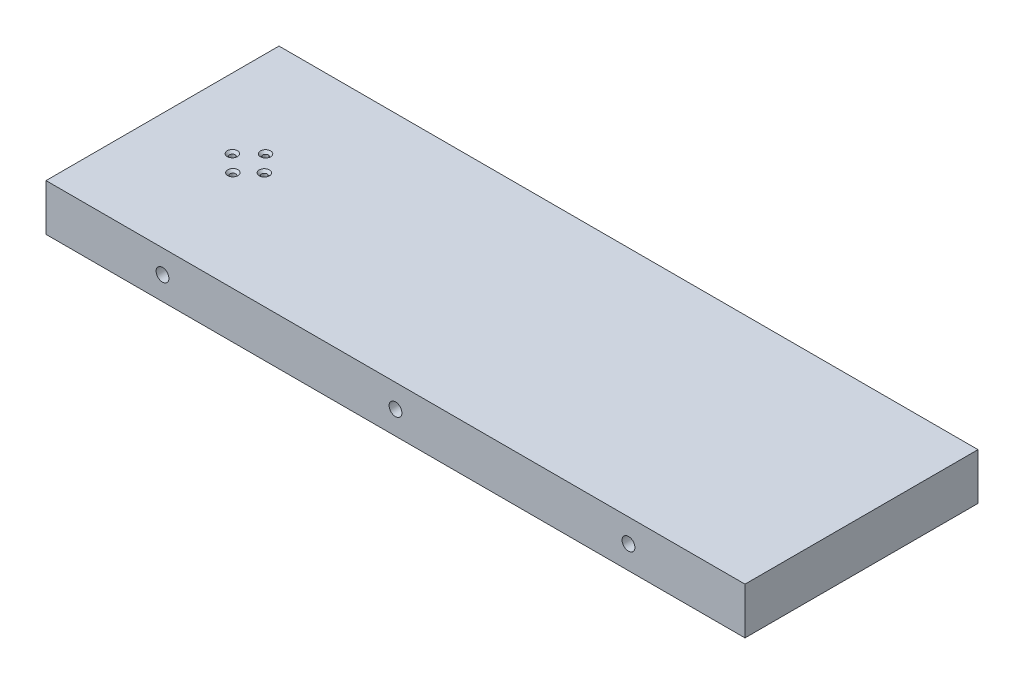
ISO-10303-21;
HEADER;
FILE_DESCRIPTION(('STEP AP214'),'2;1');
FILE_NAME('part.step','',(''),(''),'','','');
FILE_SCHEMA(('AUTOMOTIVE_DESIGN { 1 0 10303 214 1 1 1 1 }'));
ENDSEC;
DATA;
#1=APPLICATION_CONTEXT('core data for automotive mechanical design processes');
#2=APPLICATION_PROTOCOL_DEFINITION('international standard','automotive_design',2000,#1);
#3=PRODUCT_CONTEXT('',#1,'mechanical');
#4=PRODUCT('Part','Part','',(#3));
#5=PRODUCT_RELATED_PRODUCT_CATEGORY('part','',(#4));
#6=PRODUCT_DEFINITION_FORMATION('','',#4);
#7=PRODUCT_DEFINITION_CONTEXT('part definition',#1,'design');
#8=PRODUCT_DEFINITION('design','',#6,#7);
#9=PRODUCT_DEFINITION_SHAPE('','',#8);
#10=(LENGTH_UNIT() NAMED_UNIT(*) SI_UNIT(.MILLI.,.METRE.));
#11=(NAMED_UNIT(*) PLANE_ANGLE_UNIT() SI_UNIT($,.RADIAN.));
#12=(NAMED_UNIT(*) SI_UNIT($,.STERADIAN.) SOLID_ANGLE_UNIT());
#13=UNCERTAINTY_MEASURE_WITH_UNIT(LENGTH_MEASURE(1.E-05),#10,'distance_accuracy_value','');
#14=(GEOMETRIC_REPRESENTATION_CONTEXT(3) GLOBAL_UNCERTAINTY_ASSIGNED_CONTEXT((#13)) GLOBAL_UNIT_ASSIGNED_CONTEXT((#10,
#11,#12)) REPRESENTATION_CONTEXT('',''));
#15=CARTESIAN_POINT('',(0.,0.,0.));
#16=DIRECTION('',(0.,0.,1.));
#17=DIRECTION('',(1.,0.,0.));
#18=AXIS2_PLACEMENT_3D('',#15,#16,#17);
#19=CARTESIAN_POINT('',(150.,20.,-50.));
#20=DIRECTION('',(-1.,0.,0.));
#21=DIRECTION('',(0.,0.,1.));
#22=AXIS2_PLACEMENT_3D('',#19,#20,#21);
#23=PLANE('',#22);
#24=DIRECTION('',(0.,0.,-1.));
#25=VECTOR('',#24,1.);
#26=CARTESIAN_POINT('',(150.,0.,-50.));
#27=LINE('',#26,#25);
#28=CARTESIAN_POINT('',(150.,0.,50.));
#29=VERTEX_POINT('',#28);
#30=CARTESIAN_POINT('',(150.,0.,-50.));
#31=VERTEX_POINT('',#30);
#32=EDGE_CURVE('E111',#29,#31,#27,.T.);
#33=ORIENTED_EDGE('',*,*,#32,.T.);
#34=DIRECTION('',(0.,-1.,0.));
#35=VECTOR('',#34,1.);
#36=CARTESIAN_POINT('',(150.,20.,-50.));
#37=LINE('',#36,#35);
#38=CARTESIAN_POINT('',(150.,20.,-50.));
#39=VERTEX_POINT('',#38);
#40=EDGE_CURVE('E11',#39,#31,#37,.T.);
#41=ORIENTED_EDGE('',*,*,#40,.F.);
#42=DIRECTION('',(0.,0.,-1.));
#43=VECTOR('',#42,1.);
#44=CARTESIAN_POINT('',(150.,20.,-50.));
#45=LINE('',#44,#43);
#46=CARTESIAN_POINT('',(150.,20.,50.));
#47=VERTEX_POINT('',#46);
#48=EDGE_CURVE('E95',#47,#39,#45,.T.);
#49=ORIENTED_EDGE('',*,*,#48,.F.);
#50=DIRECTION('',(0.,-1.,0.));
#51=VECTOR('',#50,1.);
#52=CARTESIAN_POINT('',(150.,20.,50.));
#53=LINE('',#52,#51);
#54=EDGE_CURVE('E107',#47,#29,#53,.T.);
#55=ORIENTED_EDGE('',*,*,#54,.T.);
#56=EDGE_LOOP('',(#33,#41,#49,#55));
#57=FACE_BOUND('',#56,.T.);
#58=ADVANCED_FACE('F43',(#57),#23,.F.);
#59=CARTESIAN_POINT('',(-150.,20.,-50.));
#60=DIRECTION('',(0.,0.,1.));
#61=DIRECTION('',(1.,0.,0.));
#62=AXIS2_PLACEMENT_3D('',#59,#60,#61);
#63=PLANE('',#62);
#64=CARTESIAN_POINT('',(0.,10.,-50.));
#65=DIRECTION('',(0.,0.,-1.));
#66=DIRECTION('',(-1.,0.,0.));
#67=AXIS2_PLACEMENT_3D('',#64,#65,#66);
#68=CIRCLE('',#67,6.12);
#69=CARTESIAN_POINT('',(-6.12000000000001,10.,-50.));
#70=VERTEX_POINT('',#69);
#71=EDGE_CURVE('E223',#70,#70,#68,.T.);
#72=ORIENTED_EDGE('',*,*,#71,.F.);
#73=EDGE_LOOP('',(#72));
#74=FACE_BOUND('',#73,.T.);
#75=CARTESIAN_POINT('',(100.,10.,-50.));
#76=DIRECTION('',(0.,0.,-1.));
#77=DIRECTION('',(-1.,0.,0.));
#78=AXIS2_PLACEMENT_3D('',#75,#76,#77);
#79=CIRCLE('',#78,6.12);
#80=CARTESIAN_POINT('',(93.88,10.,-50.));
#81=VERTEX_POINT('',#80);
#82=EDGE_CURVE('E207',#81,#81,#79,.T.);
#83=ORIENTED_EDGE('',*,*,#82,.F.);
#84=EDGE_LOOP('',(#83));
#85=FACE_BOUND('',#84,.T.);
#86=CARTESIAN_POINT('',(-100.,10.,-50.));
#87=DIRECTION('',(0.,0.,-1.));
#88=DIRECTION('',(-1.,0.,0.));
#89=AXIS2_PLACEMENT_3D('',#86,#87,#88);
#90=CIRCLE('',#89,6.12);
#91=CARTESIAN_POINT('',(-106.12,10.,-50.));
#92=VERTEX_POINT('',#91);
#93=EDGE_CURVE('E191',#92,#92,#90,.T.);
#94=ORIENTED_EDGE('',*,*,#93,.F.);
#95=EDGE_LOOP('',(#94));
#96=FACE_BOUND('',#95,.T.);
#97=DIRECTION('',(-1.,0.,0.));
#98=VECTOR('',#97,1.);
#99=CARTESIAN_POINT('',(-150.,0.,-50.));
#100=LINE('',#99,#98);
#101=CARTESIAN_POINT('',(-150.,0.,-50.));
#102=VERTEX_POINT('',#101);
#103=EDGE_CURVE('E100',#31,#102,#100,.T.);
#104=ORIENTED_EDGE('',*,*,#103,.T.);
#105=DIRECTION('',(0.,-1.,0.));
#106=VECTOR('',#105,1.);
#107=CARTESIAN_POINT('',(-150.,20.,-50.));
#108=LINE('',#107,#106);
#109=CARTESIAN_POINT('',(-150.,20.,-50.));
#110=VERTEX_POINT('',#109);
#111=EDGE_CURVE('E52',#110,#102,#108,.T.);
#112=ORIENTED_EDGE('',*,*,#111,.F.);
#113=DIRECTION('',(-1.,0.,0.));
#114=VECTOR('',#113,1.);
#115=CARTESIAN_POINT('',(-150.,20.,-50.));
#116=LINE('',#115,#114);
#117=EDGE_CURVE('E90',#39,#110,#116,.T.);
#118=ORIENTED_EDGE('',*,*,#117,.F.);
#119=ORIENTED_EDGE('',*,*,#40,.T.);
#120=EDGE_LOOP('',(#104,#112,#118,#119));
#121=FACE_BOUND('',#120,.T.);
#122=ADVANCED_FACE('F99',(#74,#85,#96,#121),#63,.F.);
#123=CARTESIAN_POINT('',(-150.,20.,-50.));
#124=DIRECTION('',(1.,0.,0.));
#125=DIRECTION('',(0.,0.,-1.));
#126=AXIS2_PLACEMENT_3D('',#123,#124,#125);
#127=PLANE('',#126);
#128=DIRECTION('',(0.,0.,1.));
#129=VECTOR('',#128,1.);
#130=CARTESIAN_POINT('',(-150.,0.,-50.));
#131=LINE('',#130,#129);
#132=CARTESIAN_POINT('',(-150.,0.,50.));
#133=VERTEX_POINT('',#132);
#134=EDGE_CURVE('E77',#102,#133,#131,.T.);
#135=ORIENTED_EDGE('',*,*,#134,.T.);
#136=DIRECTION('',(0.,-1.,0.));
#137=VECTOR('',#136,1.);
#138=CARTESIAN_POINT('',(-150.,20.,50.));
#139=LINE('',#138,#137);
#140=CARTESIAN_POINT('',(-150.,20.,50.));
#141=VERTEX_POINT('',#140);
#142=EDGE_CURVE('E102',#141,#133,#139,.T.);
#143=ORIENTED_EDGE('',*,*,#142,.F.);
#144=DIRECTION('',(0.,0.,1.));
#145=VECTOR('',#144,1.);
#146=CARTESIAN_POINT('',(-150.,20.,-50.));
#147=LINE('',#146,#145);
#148=EDGE_CURVE('E93',#110,#141,#147,.T.);
#149=ORIENTED_EDGE('',*,*,#148,.F.);
#150=ORIENTED_EDGE('',*,*,#111,.T.);
#151=EDGE_LOOP('',(#135,#143,#149,#150));
#152=FACE_BOUND('',#151,.T.);
#153=ADVANCED_FACE('F103',(#152),#127,.F.);
#154=CARTESIAN_POINT('',(-150.,20.,50.));
#155=DIRECTION('',(0.,0.,-1.));
#156=DIRECTION('',(-1.,0.,0.));
#157=AXIS2_PLACEMENT_3D('',#154,#155,#156);
#158=PLANE('',#157);
#159=CARTESIAN_POINT('',(0.,10.,50.));
#160=DIRECTION('',(0.,0.,-1.));
#161=DIRECTION('',(-1.,0.,0.));
#162=AXIS2_PLACEMENT_3D('',#159,#160,#161);
#163=CIRCLE('',#162,2.74999999999998);
#164=CARTESIAN_POINT('',(-2.74999999999999,10.,50.));
#165=VERTEX_POINT('',#164);
#166=EDGE_CURVE('E211',#165,#165,#163,.T.);
#167=ORIENTED_EDGE('',*,*,#166,.T.);
#168=EDGE_LOOP('',(#167));
#169=FACE_BOUND('',#168,.T.);
#170=CARTESIAN_POINT('',(100.,10.,50.));
#171=DIRECTION('',(0.,0.,-1.));
#172=DIRECTION('',(-1.,0.,0.));
#173=AXIS2_PLACEMENT_3D('',#170,#171,#172);
#174=CIRCLE('',#173,2.74999999999997);
#175=CARTESIAN_POINT('',(97.25,10.,50.));
#176=VERTEX_POINT('',#175);
#177=EDGE_CURVE('E195',#176,#176,#174,.T.);
#178=ORIENTED_EDGE('',*,*,#177,.T.);
#179=EDGE_LOOP('',(#178));
#180=FACE_BOUND('',#179,.T.);
#181=CARTESIAN_POINT('',(-100.,10.,50.));
#182=DIRECTION('',(0.,0.,-1.));
#183=DIRECTION('',(-1.,0.,0.));
#184=AXIS2_PLACEMENT_3D('',#181,#182,#183);
#185=CIRCLE('',#184,2.74999999999997);
#186=CARTESIAN_POINT('',(-102.75,10.,50.));
#187=VERTEX_POINT('',#186);
#188=EDGE_CURVE('E179',#187,#187,#185,.T.);
#189=ORIENTED_EDGE('',*,*,#188,.T.);
#190=EDGE_LOOP('',(#189));
#191=FACE_BOUND('',#190,.T.);
#192=DIRECTION('',(1.,0.,0.));
#193=VECTOR('',#192,1.);
#194=CARTESIAN_POINT('',(-150.,0.,50.));
#195=LINE('',#194,#193);
#196=EDGE_CURVE('E83',#133,#29,#195,.T.);
#197=ORIENTED_EDGE('',*,*,#196,.T.);
#198=ORIENTED_EDGE('',*,*,#54,.F.);
#199=DIRECTION('',(1.,0.,0.));
#200=VECTOR('',#199,1.);
#201=CARTESIAN_POINT('',(-150.,20.,50.));
#202=LINE('',#201,#200);
#203=EDGE_CURVE('E60',#141,#47,#202,.T.);
#204=ORIENTED_EDGE('',*,*,#203,.F.);
#205=ORIENTED_EDGE('',*,*,#142,.T.);
#206=EDGE_LOOP('',(#197,#198,#204,#205));
#207=FACE_BOUND('',#206,.T.);
#208=ADVANCED_FACE('F125',(#169,#180,#191,#207),#158,.F.);
#209=CARTESIAN_POINT('',(0.,20.,0.));
#210=DIRECTION('',(0.,1.,0.));
#211=DIRECTION('',(0.,0.,1.));
#212=AXIS2_PLACEMENT_3D('',#209,#210,#211);
#213=PLANE('',#212);
#214=CARTESIAN_POINT('',(-120.,20.,0.));
#215=DIRECTION('',(0.,1.,0.));
#216=DIRECTION('',(0.,0.,1.));
#217=AXIS2_PLACEMENT_3D('',#214,#215,#216);
#218=CIRCLE('',#217,2.19999999999999);
#219=CARTESIAN_POINT('',(-120.,20.,2.19999999999999));
#220=VERTEX_POINT('',#219);
#221=EDGE_CURVE('E175',#220,#220,#218,.T.);
#222=ORIENTED_EDGE('',*,*,#221,.F.);
#223=EDGE_LOOP('',(#222));
#224=FACE_BOUND('',#223,.T.);
#225=CARTESIAN_POINT('',(-106.,20.,0.273765591085345));
#226=DIRECTION('',(0.,1.,0.));
#227=DIRECTION('',(0.,0.,1.));
#228=AXIS2_PLACEMENT_3D('',#225,#226,#227);
#229=CIRCLE('',#228,2.19999999999999);
#230=CARTESIAN_POINT('',(-106.,20.,2.47376559108534));
#231=VERTEX_POINT('',#230);
#232=EDGE_CURVE('E163',#231,#231,#229,.T.);
#233=ORIENTED_EDGE('',*,*,#232,.F.);
#234=EDGE_LOOP('',(#233));
#235=FACE_BOUND('',#234,.T.);
#236=CARTESIAN_POINT('',(-112.818119912593,20.,-7.04150889846757));
#237=DIRECTION('',(0.,1.,0.));
#238=DIRECTION('',(0.,0.,1.));
#239=AXIS2_PLACEMENT_3D('',#236,#237,#238);
#240=CIRCLE('',#239,2.19999999999999);
#241=CARTESIAN_POINT('',(-112.818119912593,20.,-4.84150889846757));
#242=VERTEX_POINT('',#241);
#243=EDGE_CURVE('E151',#242,#242,#240,.T.);
#244=ORIENTED_EDGE('',*,*,#243,.F.);
#245=EDGE_LOOP('',(#244));
#246=FACE_BOUND('',#245,.T.);
#247=CARTESIAN_POINT('',(-112.818119912593,20.,6.95849110153244));
#248=DIRECTION('',(0.,1.,0.));
#249=DIRECTION('',(0.,0.,1.));
#250=AXIS2_PLACEMENT_3D('',#247,#248,#249);
#251=CIRCLE('',#250,2.19999999999999);
#252=CARTESIAN_POINT('',(-112.818119912593,20.,9.15849110153243));
#253=VERTEX_POINT('',#252);
#254=EDGE_CURVE('E139',#253,#253,#251,.T.);
#255=ORIENTED_EDGE('',*,*,#254,.F.);
#256=EDGE_LOOP('',(#255));
#257=FACE_BOUND('',#256,.T.);
#258=ORIENTED_EDGE('',*,*,#48,.T.);
#259=ORIENTED_EDGE('',*,*,#117,.T.);
#260=ORIENTED_EDGE('',*,*,#148,.T.);
#261=ORIENTED_EDGE('',*,*,#203,.T.);
#262=EDGE_LOOP('',(#258,#259,#260,#261));
#263=FACE_BOUND('',#262,.T.);
#264=ADVANCED_FACE('F91',(#224,#235,#246,#257,#263),#213,.T.);
#265=CARTESIAN_POINT('',(0.,0.,0.));
#266=DIRECTION('',(0.,1.,0.));
#267=DIRECTION('',(0.,0.,1.));
#268=AXIS2_PLACEMENT_3D('',#265,#266,#267);
#269=PLANE('',#268);
#270=CARTESIAN_POINT('',(-120.,0.,0.));
#271=DIRECTION('',(0.,1.,0.));
#272=DIRECTION('',(0.,0.,1.));
#273=AXIS2_PLACEMENT_3D('',#270,#271,#272);
#274=CIRCLE('',#273,1.20000000000001);
#275=CARTESIAN_POINT('',(-120.,0.,1.20000000000001));
#276=VERTEX_POINT('',#275);
#277=EDGE_CURVE('E167',#276,#276,#274,.T.);
#278=ORIENTED_EDGE('',*,*,#277,.T.);
#279=EDGE_LOOP('',(#278));
#280=FACE_BOUND('',#279,.T.);
#281=CARTESIAN_POINT('',(-106.,0.,0.273765591085345));
#282=DIRECTION('',(0.,1.,0.));
#283=DIRECTION('',(0.,0.,1.));
#284=AXIS2_PLACEMENT_3D('',#281,#282,#283);
#285=CIRCLE('',#284,1.20000000000001);
#286=CARTESIAN_POINT('',(-106.,0.,1.47376559108535));
#287=VERTEX_POINT('',#286);
#288=EDGE_CURVE('E155',#287,#287,#285,.T.);
#289=ORIENTED_EDGE('',*,*,#288,.T.);
#290=EDGE_LOOP('',(#289));
#291=FACE_BOUND('',#290,.T.);
#292=CARTESIAN_POINT('',(-112.818119912593,0.,-7.04150889846757));
#293=DIRECTION('',(0.,1.,0.));
#294=DIRECTION('',(0.,0.,1.));
#295=AXIS2_PLACEMENT_3D('',#292,#293,#294);
#296=CIRCLE('',#295,1.20000000000001);
#297=CARTESIAN_POINT('',(-112.818119912593,0.,-5.84150889846756));
#298=VERTEX_POINT('',#297);
#299=EDGE_CURVE('E143',#298,#298,#296,.T.);
#300=ORIENTED_EDGE('',*,*,#299,.T.);
#301=EDGE_LOOP('',(#300));
#302=FACE_BOUND('',#301,.T.);
#303=CARTESIAN_POINT('',(-112.818119912593,0.,6.95849110153244));
#304=DIRECTION('',(0.,1.,0.));
#305=DIRECTION('',(0.,0.,1.));
#306=AXIS2_PLACEMENT_3D('',#303,#304,#305);
#307=CIRCLE('',#306,1.20000000000001);
#308=CARTESIAN_POINT('',(-112.818119912593,0.,8.15849110153244));
#309=VERTEX_POINT('',#308);
#310=EDGE_CURVE('E115',#309,#309,#307,.T.);
#311=ORIENTED_EDGE('',*,*,#310,.T.);
#312=EDGE_LOOP('',(#311));
#313=FACE_BOUND('',#312,.T.);
#314=ORIENTED_EDGE('',*,*,#32,.F.);
#315=ORIENTED_EDGE('',*,*,#196,.F.);
#316=ORIENTED_EDGE('',*,*,#134,.F.);
#317=ORIENTED_EDGE('',*,*,#103,.F.);
#318=EDGE_LOOP('',(#314,#315,#316,#317));
#319=FACE_BOUND('',#318,.T.);
#320=ADVANCED_FACE('F128',(#280,#291,#302,#313,#319),#269,.F.);
#321=CARTESIAN_POINT('',(-112.818119912593,20.,6.95849110153244));
#322=DIRECTION('',(0.,1.,0.));
#323=DIRECTION('',(0.,0.,1.));
#324=AXIS2_PLACEMENT_3D('',#321,#322,#323);
#325=CYLINDRICAL_SURFACE('',#324,1.20000000000001);
#326=ORIENTED_EDGE('',*,*,#310,.F.);
#327=EDGE_LOOP('',(#326));
#328=FACE_BOUND('',#327,.T.);
#329=CARTESIAN_POINT('',(-112.818119912593,19.,6.95849110153244));
#330=DIRECTION('',(0.,1.,0.));
#331=DIRECTION('',(0.,0.,1.));
#332=AXIS2_PLACEMENT_3D('',#329,#330,#331);
#333=CIRCLE('',#332,1.20000000000001);
#334=CARTESIAN_POINT('',(-112.818119912593,19.,8.15849110153244));
#335=VERTEX_POINT('',#334);
#336=EDGE_CURVE('E135',#335,#335,#333,.T.);
#337=ORIENTED_EDGE('',*,*,#336,.T.);
#338=EDGE_LOOP('',(#337));
#339=FACE_BOUND('',#338,.T.);
#340=ADVANCED_FACE('F288',(#328,#339),#325,.F.);
#341=CARTESIAN_POINT('',(-112.818119912593,20.,6.95849110153244));
#342=DIRECTION('',(0.,1.,0.));
#343=DIRECTION('',(0.,0.,1.));
#344=AXIS2_PLACEMENT_3D('',#341,#342,#343);
#345=CONICAL_SURFACE('',#344,2.19999999999999,0.785398163397442);
#346=ORIENTED_EDGE('',*,*,#336,.F.);
#347=EDGE_LOOP('',(#346));
#348=FACE_BOUND('',#347,.T.);
#349=ORIENTED_EDGE('',*,*,#254,.T.);
#350=EDGE_LOOP('',(#349));
#351=FACE_BOUND('',#350,.T.);
#352=ADVANCED_FACE('F296',(#348,#351),#345,.F.);
#353=CARTESIAN_POINT('',(-112.818119912593,20.,-7.04150889846757));
#354=DIRECTION('',(0.,1.,0.));
#355=DIRECTION('',(0.,0.,1.));
#356=AXIS2_PLACEMENT_3D('',#353,#354,#355);
#357=CYLINDRICAL_SURFACE('',#356,1.20000000000001);
#358=ORIENTED_EDGE('',*,*,#299,.F.);
#359=EDGE_LOOP('',(#358));
#360=FACE_BOUND('',#359,.T.);
#361=CARTESIAN_POINT('',(-112.818119912593,19.,-7.04150889846757));
#362=DIRECTION('',(0.,1.,0.));
#363=DIRECTION('',(0.,0.,1.));
#364=AXIS2_PLACEMENT_3D('',#361,#362,#363);
#365=CIRCLE('',#364,1.20000000000001);
#366=CARTESIAN_POINT('',(-112.818119912593,19.,-5.84150889846756));
#367=VERTEX_POINT('',#366);
#368=EDGE_CURVE('E147',#367,#367,#365,.T.);
#369=ORIENTED_EDGE('',*,*,#368,.T.);
#370=EDGE_LOOP('',(#369));
#371=FACE_BOUND('',#370,.T.);
#372=ADVANCED_FACE('F304',(#360,#371),#357,.F.);
#373=CARTESIAN_POINT('',(-112.818119912593,20.,-7.04150889846757));
#374=DIRECTION('',(0.,1.,0.));
#375=DIRECTION('',(0.,0.,1.));
#376=AXIS2_PLACEMENT_3D('',#373,#374,#375);
#377=CONICAL_SURFACE('',#376,2.19999999999999,0.785398163397442);
#378=ORIENTED_EDGE('',*,*,#368,.F.);
#379=EDGE_LOOP('',(#378));
#380=FACE_BOUND('',#379,.T.);
#381=ORIENTED_EDGE('',*,*,#243,.T.);
#382=EDGE_LOOP('',(#381));
#383=FACE_BOUND('',#382,.T.);
#384=ADVANCED_FACE('F312',(#380,#383),#377,.F.);
#385=CARTESIAN_POINT('',(-106.,20.,0.273765591085345));
#386=DIRECTION('',(0.,1.,0.));
#387=DIRECTION('',(0.,0.,1.));
#388=AXIS2_PLACEMENT_3D('',#385,#386,#387);
#389=CYLINDRICAL_SURFACE('',#388,1.20000000000001);
#390=ORIENTED_EDGE('',*,*,#288,.F.);
#391=EDGE_LOOP('',(#390));
#392=FACE_BOUND('',#391,.T.);
#393=CARTESIAN_POINT('',(-106.,19.,0.273765591085345));
#394=DIRECTION('',(0.,1.,0.));
#395=DIRECTION('',(0.,0.,1.));
#396=AXIS2_PLACEMENT_3D('',#393,#394,#395);
#397=CIRCLE('',#396,1.20000000000001);
#398=CARTESIAN_POINT('',(-106.,19.,1.47376559108535));
#399=VERTEX_POINT('',#398);
#400=EDGE_CURVE('E159',#399,#399,#397,.T.);
#401=ORIENTED_EDGE('',*,*,#400,.T.);
#402=EDGE_LOOP('',(#401));
#403=FACE_BOUND('',#402,.T.);
#404=ADVANCED_FACE('F320',(#392,#403),#389,.F.);
#405=CARTESIAN_POINT('',(-106.,20.,0.273765591085345));
#406=DIRECTION('',(0.,1.,0.));
#407=DIRECTION('',(0.,0.,1.));
#408=AXIS2_PLACEMENT_3D('',#405,#406,#407);
#409=CONICAL_SURFACE('',#408,2.19999999999999,0.785398163397442);
#410=ORIENTED_EDGE('',*,*,#400,.F.);
#411=EDGE_LOOP('',(#410));
#412=FACE_BOUND('',#411,.T.);
#413=ORIENTED_EDGE('',*,*,#232,.T.);
#414=EDGE_LOOP('',(#413));
#415=FACE_BOUND('',#414,.T.);
#416=ADVANCED_FACE('F328',(#412,#415),#409,.F.);
#417=CARTESIAN_POINT('',(-120.,20.,0.));
#418=DIRECTION('',(0.,1.,0.));
#419=DIRECTION('',(0.,0.,1.));
#420=AXIS2_PLACEMENT_3D('',#417,#418,#419);
#421=CYLINDRICAL_SURFACE('',#420,1.20000000000001);
#422=ORIENTED_EDGE('',*,*,#277,.F.);
#423=EDGE_LOOP('',(#422));
#424=FACE_BOUND('',#423,.T.);
#425=CARTESIAN_POINT('',(-120.,19.,0.));
#426=DIRECTION('',(0.,1.,0.));
#427=DIRECTION('',(0.,0.,1.));
#428=AXIS2_PLACEMENT_3D('',#425,#426,#427);
#429=CIRCLE('',#428,1.20000000000001);
#430=CARTESIAN_POINT('',(-120.,19.,1.20000000000001));
#431=VERTEX_POINT('',#430);
#432=EDGE_CURVE('E171',#431,#431,#429,.T.);
#433=ORIENTED_EDGE('',*,*,#432,.T.);
#434=EDGE_LOOP('',(#433));
#435=FACE_BOUND('',#434,.T.);
#436=ADVANCED_FACE('F336',(#424,#435),#421,.F.);
#437=CARTESIAN_POINT('',(-120.,20.,0.));
#438=DIRECTION('',(0.,1.,0.));
#439=DIRECTION('',(0.,0.,1.));
#440=AXIS2_PLACEMENT_3D('',#437,#438,#439);
#441=CONICAL_SURFACE('',#440,2.19999999999999,0.785398163397442);
#442=ORIENTED_EDGE('',*,*,#432,.F.);
#443=EDGE_LOOP('',(#442));
#444=FACE_BOUND('',#443,.T.);
#445=ORIENTED_EDGE('',*,*,#221,.T.);
#446=EDGE_LOOP('',(#445));
#447=FACE_BOUND('',#446,.T.);
#448=ADVANCED_FACE('F344',(#444,#447),#441,.F.);
#449=CARTESIAN_POINT('',(-100.,10.,-50.));
#450=DIRECTION('',(0.,0.,-1.));
#451=DIRECTION('',(-1.,0.,0.));
#452=AXIS2_PLACEMENT_3D('',#449,#450,#451);
#453=CYLINDRICAL_SURFACE('',#452,2.74999999999999);
#454=ORIENTED_EDGE('',*,*,#188,.F.);
#455=EDGE_LOOP('',(#454));
#456=FACE_BOUND('',#455,.T.);
#457=CARTESIAN_POINT('',(-100.,10.,-46.42));
#458=DIRECTION('',(0.,0.,-1.));
#459=DIRECTION('',(-1.,0.,0.));
#460=AXIS2_PLACEMENT_3D('',#457,#458,#459);
#461=CIRCLE('',#460,2.75);
#462=CARTESIAN_POINT('',(-102.75,10.,-46.42));
#463=VERTEX_POINT('',#462);
#464=EDGE_CURVE('E183',#463,#463,#461,.T.);
#465=ORIENTED_EDGE('',*,*,#464,.T.);
#466=EDGE_LOOP('',(#465));
#467=FACE_BOUND('',#466,.T.);
#468=ADVANCED_FACE('F249',(#456,#467),#453,.F.);
#469=CARTESIAN_POINT('',(-97.25,10.,-46.42));
#470=DIRECTION('',(0.,0.,1.));
#471=DIRECTION('',(1.,0.,0.));
#472=AXIS2_PLACEMENT_3D('',#469,#470,#471);
#473=PLANE('',#472);
#474=ORIENTED_EDGE('',*,*,#464,.F.);
#475=EDGE_LOOP('',(#474));
#476=FACE_BOUND('',#475,.T.);
#477=CARTESIAN_POINT('',(-100.,10.,-46.42));
#478=DIRECTION('',(0.,0.,-1.));
#479=DIRECTION('',(-1.,0.,0.));
#480=AXIS2_PLACEMENT_3D('',#477,#478,#479);
#481=CIRCLE('',#480,6.12);
#482=CARTESIAN_POINT('',(-106.12,10.,-46.42));
#483=VERTEX_POINT('',#482);
#484=EDGE_CURVE('E187',#483,#483,#481,.T.);
#485=ORIENTED_EDGE('',*,*,#484,.T.);
#486=EDGE_LOOP('',(#485));
#487=FACE_BOUND('',#486,.T.);
#488=ADVANCED_FACE('F239',(#476,#487),#473,.F.);
#489=CARTESIAN_POINT('',(-100.,10.,-50.));
#490=DIRECTION('',(0.,0.,-1.));
#491=DIRECTION('',(-1.,0.,0.));
#492=AXIS2_PLACEMENT_3D('',#489,#490,#491);
#493=CYLINDRICAL_SURFACE('',#492,6.12);
#494=ORIENTED_EDGE('',*,*,#484,.F.);
#495=EDGE_LOOP('',(#494));
#496=FACE_BOUND('',#495,.T.);
#497=ORIENTED_EDGE('',*,*,#93,.T.);
#498=EDGE_LOOP('',(#497));
#499=FACE_BOUND('',#498,.T.);
#500=ADVANCED_FACE('F236',(#496,#499),#493,.F.);
#501=CARTESIAN_POINT('',(100.,10.,-50.));
#502=DIRECTION('',(0.,0.,-1.));
#503=DIRECTION('',(-1.,0.,0.));
#504=AXIS2_PLACEMENT_3D('',#501,#502,#503);
#505=CYLINDRICAL_SURFACE('',#504,2.74999999999999);
#506=ORIENTED_EDGE('',*,*,#177,.F.);
#507=EDGE_LOOP('',(#506));
#508=FACE_BOUND('',#507,.T.);
#509=CARTESIAN_POINT('',(100.,10.,-46.42));
#510=DIRECTION('',(0.,0.,-1.));
#511=DIRECTION('',(-1.,0.,0.));
#512=AXIS2_PLACEMENT_3D('',#509,#510,#511);
#513=CIRCLE('',#512,2.75);
#514=CARTESIAN_POINT('',(97.25,10.,-46.42));
#515=VERTEX_POINT('',#514);
#516=EDGE_CURVE('E199',#515,#515,#513,.T.);
#517=ORIENTED_EDGE('',*,*,#516,.T.);
#518=EDGE_LOOP('',(#517));
#519=FACE_BOUND('',#518,.T.);
#520=ADVANCED_FACE('F238',(#508,#519),#505,.F.);
#521=CARTESIAN_POINT('',(102.75,10.,-46.42));
#522=DIRECTION('',(0.,0.,1.));
#523=DIRECTION('',(1.,0.,0.));
#524=AXIS2_PLACEMENT_3D('',#521,#522,#523);
#525=PLANE('',#524);
#526=ORIENTED_EDGE('',*,*,#516,.F.);
#527=EDGE_LOOP('',(#526));
#528=FACE_BOUND('',#527,.T.);
#529=CARTESIAN_POINT('',(100.,10.,-46.42));
#530=DIRECTION('',(0.,0.,-1.));
#531=DIRECTION('',(-1.,0.,0.));
#532=AXIS2_PLACEMENT_3D('',#529,#530,#531);
#533=CIRCLE('',#532,6.12);
#534=CARTESIAN_POINT('',(93.88,10.,-46.42));
#535=VERTEX_POINT('',#534);
#536=EDGE_CURVE('E203',#535,#535,#533,.T.);
#537=ORIENTED_EDGE('',*,*,#536,.T.);
#538=EDGE_LOOP('',(#537));
#539=FACE_BOUND('',#538,.T.);
#540=ADVANCED_FACE('F246',(#528,#539),#525,.F.);
#541=CARTESIAN_POINT('',(100.,10.,-50.));
#542=DIRECTION('',(0.,0.,-1.));
#543=DIRECTION('',(-1.,0.,0.));
#544=AXIS2_PLACEMENT_3D('',#541,#542,#543);
#545=CYLINDRICAL_SURFACE('',#544,6.12);
#546=ORIENTED_EDGE('',*,*,#536,.F.);
#547=EDGE_LOOP('',(#546));
#548=FACE_BOUND('',#547,.T.);
#549=ORIENTED_EDGE('',*,*,#82,.T.);
#550=EDGE_LOOP('',(#549));
#551=FACE_BOUND('',#550,.T.);
#552=ADVANCED_FACE('F384',(#548,#551),#545,.F.);
#553=CARTESIAN_POINT('',(0.,10.,-50.));
#554=DIRECTION('',(0.,0.,-1.));
#555=DIRECTION('',(-1.,0.,0.));
#556=AXIS2_PLACEMENT_3D('',#553,#554,#555);
#557=CYLINDRICAL_SURFACE('',#556,2.74999999999999);
#558=ORIENTED_EDGE('',*,*,#166,.F.);
#559=EDGE_LOOP('',(#558));
#560=FACE_BOUND('',#559,.T.);
#561=CARTESIAN_POINT('',(0.,10.,-46.42));
#562=DIRECTION('',(0.,0.,-1.));
#563=DIRECTION('',(-1.,0.,0.));
#564=AXIS2_PLACEMENT_3D('',#561,#562,#563);
#565=CIRCLE('',#564,2.75);
#566=CARTESIAN_POINT('',(-2.75000000000001,10.,-46.42));
#567=VERTEX_POINT('',#566);
#568=EDGE_CURVE('E215',#567,#567,#565,.T.);
#569=ORIENTED_EDGE('',*,*,#568,.T.);
#570=EDGE_LOOP('',(#569));
#571=FACE_BOUND('',#570,.T.);
#572=ADVANCED_FACE('F395',(#560,#571),#557,.F.);
#573=CARTESIAN_POINT('',(2.74999999999998,10.,-46.42));
#574=DIRECTION('',(0.,0.,1.));
#575=DIRECTION('',(1.,0.,0.));
#576=AXIS2_PLACEMENT_3D('',#573,#574,#575);
#577=PLANE('',#576);
#578=ORIENTED_EDGE('',*,*,#568,.F.);
#579=EDGE_LOOP('',(#578));
#580=FACE_BOUND('',#579,.T.);
#581=CARTESIAN_POINT('',(0.,10.,-46.42));
#582=DIRECTION('',(0.,0.,-1.));
#583=DIRECTION('',(-1.,0.,0.));
#584=AXIS2_PLACEMENT_3D('',#581,#582,#583);
#585=CIRCLE('',#584,6.12);
#586=CARTESIAN_POINT('',(-6.12000000000001,10.,-46.42));
#587=VERTEX_POINT('',#586);
#588=EDGE_CURVE('E219',#587,#587,#585,.T.);
#589=ORIENTED_EDGE('',*,*,#588,.T.);
#590=EDGE_LOOP('',(#589));
#591=FACE_BOUND('',#590,.T.);
#592=ADVANCED_FACE('F406',(#580,#591),#577,.F.);
#593=CARTESIAN_POINT('',(0.,10.,-50.));
#594=DIRECTION('',(0.,0.,-1.));
#595=DIRECTION('',(-1.,0.,0.));
#596=AXIS2_PLACEMENT_3D('',#593,#594,#595);
#597=CYLINDRICAL_SURFACE('',#596,6.12);
#598=ORIENTED_EDGE('',*,*,#588,.F.);
#599=EDGE_LOOP('',(#598));
#600=FACE_BOUND('',#599,.T.);
#601=ORIENTED_EDGE('',*,*,#71,.T.);
#602=EDGE_LOOP('',(#601));
#603=FACE_BOUND('',#602,.T.);
#604=ADVANCED_FACE('F228',(#600,#603),#597,.F.);
#605=CLOSED_SHELL('',(#58,#122,#153,#208,#264,#320,#340,#352,#372,#384,#404,#416,#436,#448,#468,
#488,#500,#520,#540,#552,#572,#592,#604));
#606=MANIFOLD_SOLID_BREP('B2',#605);
#607=ADVANCED_BREP_SHAPE_REPRESENTATION('',(#18,#606),#14);
#608=SHAPE_DEFINITION_REPRESENTATION(#9,#607);
ENDSEC;
END-ISO-10303-21;
